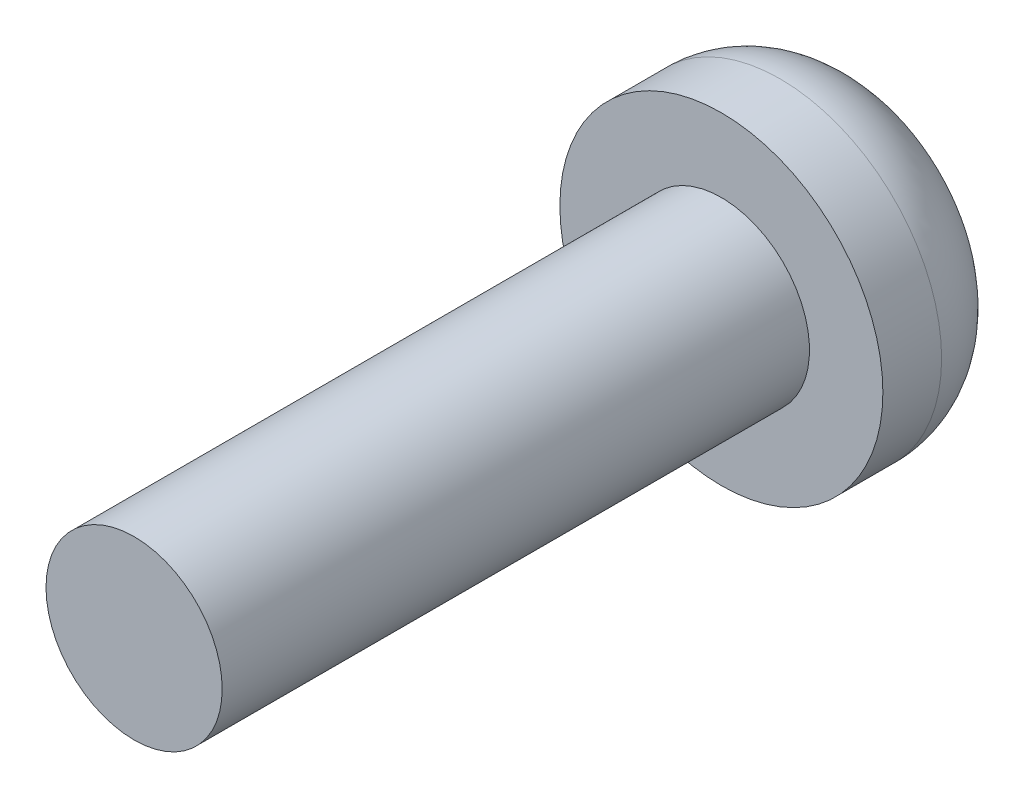
ISO-10303-21;
HEADER;
FILE_DESCRIPTION(('STEP AP214'),'2;1');
FILE_NAME('part.step','',(''),(''),'','','');
FILE_SCHEMA(('AUTOMOTIVE_DESIGN { 1 0 10303 214 1 1 1 1 }'));
ENDSEC;
DATA;
#1=APPLICATION_CONTEXT('core data for automotive mechanical design processes');
#2=APPLICATION_PROTOCOL_DEFINITION('international standard','automotive_design',2000,#1);
#3=PRODUCT_CONTEXT('',#1,'mechanical');
#4=PRODUCT('Part','Part','',(#3));
#5=PRODUCT_RELATED_PRODUCT_CATEGORY('part','',(#4));
#6=PRODUCT_DEFINITION_FORMATION('','',#4);
#7=PRODUCT_DEFINITION_CONTEXT('part definition',#1,'design');
#8=PRODUCT_DEFINITION('design','',#6,#7);
#9=PRODUCT_DEFINITION_SHAPE('','',#8);
#10=(LENGTH_UNIT() NAMED_UNIT(*) SI_UNIT(.MILLI.,.METRE.));
#11=(NAMED_UNIT(*) PLANE_ANGLE_UNIT() SI_UNIT($,.RADIAN.));
#12=(NAMED_UNIT(*) SI_UNIT($,.STERADIAN.) SOLID_ANGLE_UNIT());
#13=UNCERTAINTY_MEASURE_WITH_UNIT(LENGTH_MEASURE(1.E-05),#10,'distance_accuracy_value','');
#14=(GEOMETRIC_REPRESENTATION_CONTEXT(3) GLOBAL_UNCERTAINTY_ASSIGNED_CONTEXT((#13)) GLOBAL_UNIT_ASSIGNED_CONTEXT((#10,
#11,#12)) REPRESENTATION_CONTEXT('',''));
#15=CARTESIAN_POINT('',(0.,0.,0.));
#16=DIRECTION('',(0.,0.,1.));
#17=DIRECTION('',(1.,0.,0.));
#18=AXIS2_PLACEMENT_3D('',#15,#16,#17);
#19=CARTESIAN_POINT('',(0.,0.,10.));
#20=DIRECTION('',(0.,0.,-1.));
#21=DIRECTION('',(-1.,0.,0.));
#22=AXIS2_PLACEMENT_3D('',#19,#20,#21);
#23=CYLINDRICAL_SURFACE('',#22,1.5);
#24=CARTESIAN_POINT('',(0.,0.,10.));
#25=DIRECTION('',(0.,0.,1.));
#26=DIRECTION('',(1.,0.,0.));
#27=AXIS2_PLACEMENT_3D('',#24,#25,#26);
#28=CIRCLE('',#27,1.5);
#29=CARTESIAN_POINT('',(1.5,0.,10.));
#30=VERTEX_POINT('',#29);
#31=EDGE_CURVE('E42',#30,#30,#28,.T.);
#32=ORIENTED_EDGE('',*,*,#31,.F.);
#33=EDGE_LOOP('',(#32));
#34=FACE_BOUND('',#33,.T.);
#35=CARTESIAN_POINT('',(0.,0.,0.));
#36=DIRECTION('',(0.,0.,-1.));
#37=DIRECTION('',(-1.,0.,0.));
#38=AXIS2_PLACEMENT_3D('',#35,#36,#37);
#39=CIRCLE('',#38,1.5);
#40=CARTESIAN_POINT('',(-1.5,0.,0.));
#41=VERTEX_POINT('',#40);
#42=EDGE_CURVE('E46',#41,#41,#39,.T.);
#43=ORIENTED_EDGE('',*,*,#42,.F.);
#44=EDGE_LOOP('',(#43));
#45=FACE_BOUND('',#44,.T.);
#46=ADVANCED_FACE('F31',(#34,#45),#23,.T.);
#47=CARTESIAN_POINT('',(0.,0.,10.));
#48=DIRECTION('',(0.,0.,1.));
#49=DIRECTION('',(1.,0.,0.));
#50=AXIS2_PLACEMENT_3D('',#47,#48,#49);
#51=PLANE('',#50);
#52=ORIENTED_EDGE('',*,*,#31,.T.);
#53=EDGE_LOOP('',(#52));
#54=FACE_BOUND('',#53,.T.);
#55=ADVANCED_FACE('F60',(#54),#51,.T.);
#56=CARTESIAN_POINT('',(0.,0.,0.));
#57=DIRECTION('',(0.,0.,-1.));
#58=DIRECTION('',(-1.,0.,0.));
#59=AXIS2_PLACEMENT_3D('',#56,#57,#58);
#60=PLANE('',#59);
#61=CARTESIAN_POINT('',(0.,0.,0.));
#62=DIRECTION('',(0.,0.,-1.));
#63=DIRECTION('',(-1.,0.,0.));
#64=AXIS2_PLACEMENT_3D('',#61,#62,#63);
#65=CIRCLE('',#64,2.75);
#66=CARTESIAN_POINT('',(-2.75,0.,0.));
#67=VERTEX_POINT('',#66);
#68=EDGE_CURVE('E51',#67,#67,#65,.T.);
#69=ORIENTED_EDGE('',*,*,#68,.F.);
#70=EDGE_LOOP('',(#69));
#71=FACE_BOUND('',#70,.T.);
#72=ORIENTED_EDGE('',*,*,#42,.T.);
#73=EDGE_LOOP('',(#72));
#74=FACE_BOUND('',#73,.T.);
#75=ADVANCED_FACE('F57',(#71,#74),#60,.F.);
#76=CARTESIAN_POINT('',(0.,0.,-2.5));
#77=DIRECTION('',(0.,0.,1.));
#78=DIRECTION('',(1.,0.,0.));
#79=AXIS2_PLACEMENT_3D('',#76,#77,#78);
#80=CYLINDRICAL_SURFACE('',#79,2.75);
#81=CARTESIAN_POINT('',(0.,0.,-1.));
#82=DIRECTION('',(0.,0.,-1.));
#83=DIRECTION('',(-1.,0.,0.));
#84=AXIS2_PLACEMENT_3D('',#81,#82,#83);
#85=CIRCLE('',#84,2.75);
#86=CARTESIAN_POINT('',(-2.75,0.,-1.));
#87=VERTEX_POINT('',#86);
#88=EDGE_CURVE('E10',#87,#87,#85,.F.);
#89=ORIENTED_EDGE('',*,*,#88,.T.);
#90=EDGE_LOOP('',(#89));
#91=FACE_BOUND('',#90,.T.);
#92=ORIENTED_EDGE('',*,*,#68,.T.);
#93=EDGE_LOOP('',(#92));
#94=FACE_BOUND('',#93,.T.);
#95=ADVANCED_FACE('F55',(#91,#94),#80,.T.);
#96=CARTESIAN_POINT('',(0.,0.,-2.5));
#97=DIRECTION('',(0.,0.,-1.));
#98=DIRECTION('',(-1.,0.,0.));
#99=AXIS2_PLACEMENT_3D('',#96,#97,#98);
#100=PLANE('',#99);
#101=CARTESIAN_POINT('',(0.,0.,-2.5));
#102=DIRECTION('',(0.,0.,-1.));
#103=DIRECTION('',(-1.,0.,0.));
#104=AXIS2_PLACEMENT_3D('',#101,#102,#103);
#105=CIRCLE('',#104,1.25);
#106=CARTESIAN_POINT('',(-1.25,0.,-2.5));
#107=VERTEX_POINT('',#106);
#108=EDGE_CURVE('E38',#107,#107,#105,.T.);
#109=ORIENTED_EDGE('',*,*,#108,.T.);
#110=EDGE_LOOP('',(#109));
#111=FACE_BOUND('',#110,.T.);
#112=ADVANCED_FACE('F74',(#111),#100,.T.);
#113=CARTESIAN_POINT('',(0.,0.,-1.));
#114=DIRECTION('',(0.,0.,-1.));
#115=DIRECTION('',(-1.,0.,0.));
#116=AXIS2_PLACEMENT_3D('',#113,#114,#115);
#117=DEGENERATE_TOROIDAL_SURFACE('',#116,1.25,1.5,.T.);
#118=ORIENTED_EDGE('',*,*,#88,.F.);
#119=EDGE_LOOP('',(#118));
#120=FACE_BOUND('',#119,.T.);
#121=ORIENTED_EDGE('',*,*,#108,.F.);
#122=EDGE_LOOP('',(#121));
#123=FACE_BOUND('',#122,.T.);
#124=ADVANCED_FACE('F33',(#120,#123),#117,.T.);
#125=CLOSED_SHELL('',(#46,#55,#75,#95,#112,#124));
#126=MANIFOLD_SOLID_BREP('B2',#125);
#127=ADVANCED_BREP_SHAPE_REPRESENTATION('',(#18,#126),#14);
#128=SHAPE_DEFINITION_REPRESENTATION(#9,#127);
ENDSEC;
END-ISO-10303-21;
